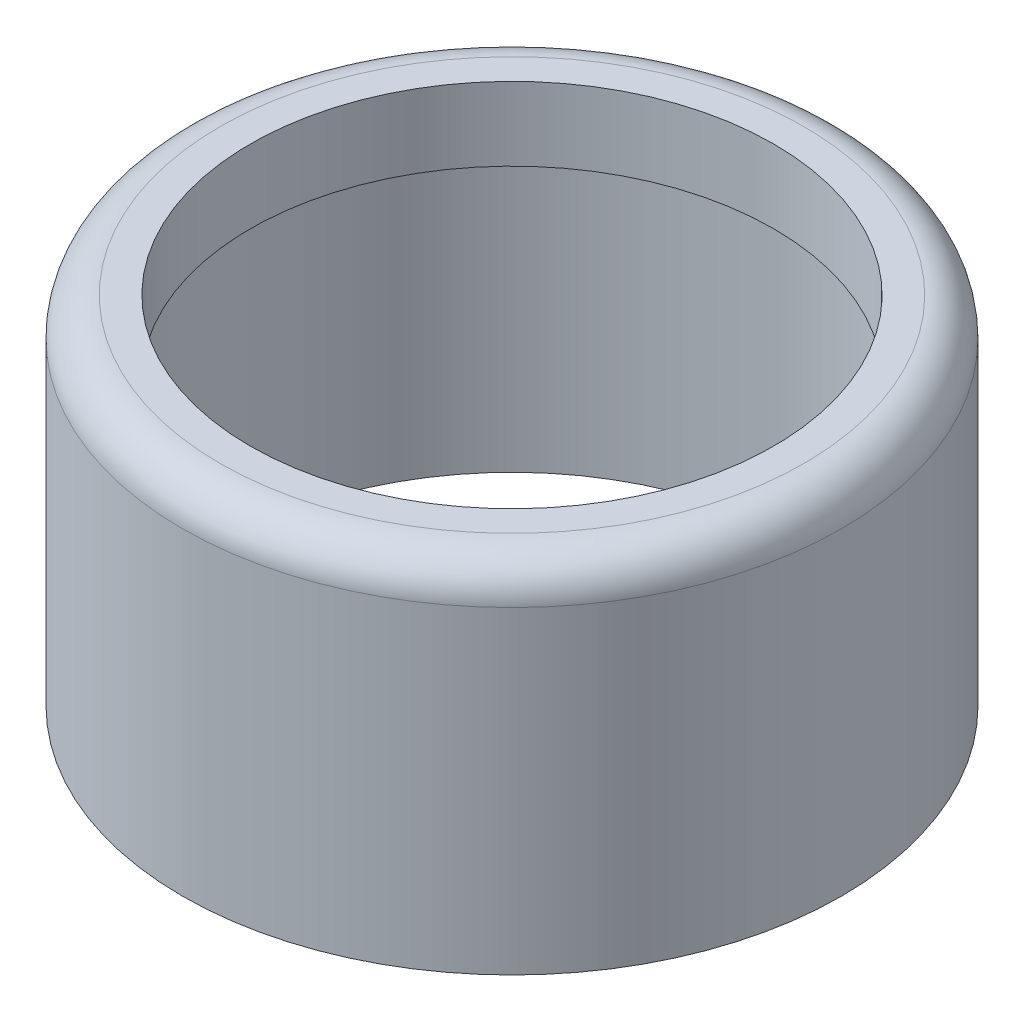
ISO-10303-21;
HEADER;
FILE_DESCRIPTION(('STEP AP214'),'2;1');
FILE_NAME('part.step','',(''),(''),'','','');
FILE_SCHEMA(('AUTOMOTIVE_DESIGN { 1 0 10303 214 1 1 1 1 }'));
ENDSEC;
DATA;
#1=APPLICATION_CONTEXT('core data for automotive mechanical design processes');
#2=APPLICATION_PROTOCOL_DEFINITION('international standard','automotive_design',2000,#1);
#3=PRODUCT_CONTEXT('',#1,'mechanical');
#4=PRODUCT('Part','Part','',(#3));
#5=PRODUCT_RELATED_PRODUCT_CATEGORY('part','',(#4));
#6=PRODUCT_DEFINITION_FORMATION('','',#4);
#7=PRODUCT_DEFINITION_CONTEXT('part definition',#1,'design');
#8=PRODUCT_DEFINITION('design','',#6,#7);
#9=PRODUCT_DEFINITION_SHAPE('','',#8);
#10=(LENGTH_UNIT() NAMED_UNIT(*) SI_UNIT(.MILLI.,.METRE.));
#11=(NAMED_UNIT(*) PLANE_ANGLE_UNIT() SI_UNIT($,.RADIAN.));
#12=(NAMED_UNIT(*) SI_UNIT($,.STERADIAN.) SOLID_ANGLE_UNIT());
#13=UNCERTAINTY_MEASURE_WITH_UNIT(LENGTH_MEASURE(1.E-05),#10,'distance_accuracy_value','');
#14=(GEOMETRIC_REPRESENTATION_CONTEXT(3) GLOBAL_UNCERTAINTY_ASSIGNED_CONTEXT((#13)) GLOBAL_UNIT_ASSIGNED_CONTEXT((#10,
#11,#12)) REPRESENTATION_CONTEXT('',''));
#15=CARTESIAN_POINT('',(0.,0.,0.));
#16=DIRECTION('',(0.,0.,1.));
#17=DIRECTION('',(1.,0.,0.));
#18=AXIS2_PLACEMENT_3D('',#15,#16,#17);
#19=CARTESIAN_POINT('',(0.,-2.9624390955405,0.));
#20=DIRECTION('',(0.,1.,0.));
#21=DIRECTION('',(0.,0.,1.));
#22=AXIS2_PLACEMENT_3D('',#19,#20,#21);
#23=TOROIDAL_SURFACE('',#22,15.5,2.);
#24=CARTESIAN_POINT('',(0.,-0.962439095540502,0.));
#25=DIRECTION('',(0.,1.,0.));
#26=DIRECTION('',(0.,0.,1.));
#27=AXIS2_PLACEMENT_3D('',#24,#25,#26);
#28=CIRCLE('',#27,15.5);
#29=CARTESIAN_POINT('',(0.,-0.962439095540502,15.5));
#30=VERTEX_POINT('',#29);
#31=EDGE_CURVE('E10',#30,#30,#28,.T.);
#32=ORIENTED_EDGE('',*,*,#31,.F.);
#33=EDGE_LOOP('',(#32));
#34=FACE_BOUND('',#33,.T.);
#35=CARTESIAN_POINT('',(0.,-2.9624390955405,0.));
#36=DIRECTION('',(0.,1.,0.));
#37=DIRECTION('',(0.,0.,1.));
#38=AXIS2_PLACEMENT_3D('',#35,#36,#37);
#39=CIRCLE('',#38,17.5);
#40=CARTESIAN_POINT('',(0.,-2.9624390955405,17.5));
#41=VERTEX_POINT('',#40);
#42=EDGE_CURVE('E72',#41,#41,#39,.T.);
#43=ORIENTED_EDGE('',*,*,#42,.T.);
#44=EDGE_LOOP('',(#43));
#45=FACE_BOUND('',#44,.T.);
#46=ADVANCED_FACE('F41',(#34,#45),#23,.T.);
#47=CARTESIAN_POINT('',(13.9,-0.962439095540502,0.));
#48=DIRECTION('',(0.,-1.,0.));
#49=DIRECTION('',(0.,0.,-1.));
#50=AXIS2_PLACEMENT_3D('',#47,#48,#49);
#51=PLANE('',#50);
#52=CARTESIAN_POINT('',(0.,-0.962439095540502,0.));
#53=DIRECTION('',(0.,1.,0.));
#54=DIRECTION('',(0.,0.,1.));
#55=AXIS2_PLACEMENT_3D('',#52,#53,#54);
#56=CIRCLE('',#55,13.9);
#57=CARTESIAN_POINT('',(0.,-0.962439095540502,13.9));
#58=VERTEX_POINT('',#57);
#59=EDGE_CURVE('E48',#58,#58,#56,.T.);
#60=ORIENTED_EDGE('',*,*,#59,.F.);
#61=EDGE_LOOP('',(#60));
#62=FACE_BOUND('',#61,.T.);
#63=ORIENTED_EDGE('',*,*,#31,.T.);
#64=EDGE_LOOP('',(#63));
#65=FACE_BOUND('',#64,.T.);
#66=ADVANCED_FACE('F104',(#62,#65),#51,.F.);
#67=CARTESIAN_POINT('',(0.,0.,0.));
#68=DIRECTION('',(0.,1.,0.));
#69=DIRECTION('',(0.,0.,1.));
#70=AXIS2_PLACEMENT_3D('',#67,#68,#69);
#71=CYLINDRICAL_SURFACE('',#70,13.9);
#72=CARTESIAN_POINT('',(0.,-4.8624390955405,0.));
#73=DIRECTION('',(0.,1.,0.));
#74=DIRECTION('',(0.,0.,1.));
#75=AXIS2_PLACEMENT_3D('',#72,#73,#74);
#76=CIRCLE('',#75,13.9);
#77=CARTESIAN_POINT('',(0.,-4.8624390955405,13.9));
#78=VERTEX_POINT('',#77);
#79=EDGE_CURVE('E53',#78,#78,#76,.T.);
#80=ORIENTED_EDGE('',*,*,#79,.F.);
#81=EDGE_LOOP('',(#80));
#82=FACE_BOUND('',#81,.T.);
#83=ORIENTED_EDGE('',*,*,#59,.T.);
#84=EDGE_LOOP('',(#83));
#85=FACE_BOUND('',#84,.T.);
#86=ADVANCED_FACE('F99',(#82,#85),#71,.F.);
#87=CARTESIAN_POINT('',(15.2,-4.8624390955405,0.));
#88=DIRECTION('',(0.,1.,0.));
#89=DIRECTION('',(0.,0.,1.));
#90=AXIS2_PLACEMENT_3D('',#87,#88,#89);
#91=PLANE('',#90);
#92=CARTESIAN_POINT('',(0.,-4.8624390955405,0.));
#93=DIRECTION('',(0.,1.,0.));
#94=DIRECTION('',(0.,0.,1.));
#95=AXIS2_PLACEMENT_3D('',#92,#93,#94);
#96=CIRCLE('',#95,15.2);
#97=CARTESIAN_POINT('',(0.,-4.8624390955405,15.2));
#98=VERTEX_POINT('',#97);
#99=EDGE_CURVE('E58',#98,#98,#96,.T.);
#100=ORIENTED_EDGE('',*,*,#99,.F.);
#101=EDGE_LOOP('',(#100));
#102=FACE_BOUND('',#101,.T.);
#103=ORIENTED_EDGE('',*,*,#79,.T.);
#104=EDGE_LOOP('',(#103));
#105=FACE_BOUND('',#104,.T.);
#106=ADVANCED_FACE('F93',(#102,#105),#91,.F.);
#107=CARTESIAN_POINT('',(0.,0.,0.));
#108=DIRECTION('',(0.,1.,0.));
#109=DIRECTION('',(0.,0.,1.));
#110=AXIS2_PLACEMENT_3D('',#107,#108,#109);
#111=CYLINDRICAL_SURFACE('',#110,15.2);
#112=CARTESIAN_POINT('',(0.,-19.8624390955405,0.));
#113=DIRECTION('',(0.,1.,0.));
#114=DIRECTION('',(0.,0.,1.));
#115=AXIS2_PLACEMENT_3D('',#112,#113,#114);
#116=CIRCLE('',#115,15.2);
#117=CARTESIAN_POINT('',(0.,-19.8624390955405,15.2));
#118=VERTEX_POINT('',#117);
#119=EDGE_CURVE('E64',#118,#118,#116,.T.);
#120=ORIENTED_EDGE('',*,*,#119,.F.);
#121=EDGE_LOOP('',(#120));
#122=FACE_BOUND('',#121,.T.);
#123=ORIENTED_EDGE('',*,*,#99,.T.);
#124=EDGE_LOOP('',(#123));
#125=FACE_BOUND('',#124,.T.);
#126=ADVANCED_FACE('F87',(#122,#125),#111,.F.);
#127=CARTESIAN_POINT('',(17.5,-19.8624390955405,0.));
#128=DIRECTION('',(0.,1.,0.));
#129=DIRECTION('',(0.,0.,1.));
#130=AXIS2_PLACEMENT_3D('',#127,#128,#129);
#131=PLANE('',#130);
#132=CARTESIAN_POINT('',(0.,-19.8624390955405,0.));
#133=DIRECTION('',(0.,1.,0.));
#134=DIRECTION('',(0.,0.,1.));
#135=AXIS2_PLACEMENT_3D('',#132,#133,#134);
#136=CIRCLE('',#135,17.5);
#137=CARTESIAN_POINT('',(0.,-19.8624390955405,17.5));
#138=VERTEX_POINT('',#137);
#139=EDGE_CURVE('E68',#138,#138,#136,.T.);
#140=ORIENTED_EDGE('',*,*,#139,.F.);
#141=EDGE_LOOP('',(#140));
#142=FACE_BOUND('',#141,.T.);
#143=ORIENTED_EDGE('',*,*,#119,.T.);
#144=EDGE_LOOP('',(#143));
#145=FACE_BOUND('',#144,.T.);
#146=ADVANCED_FACE('F81',(#142,#145),#131,.F.);
#147=CARTESIAN_POINT('',(0.,0.,0.));
#148=DIRECTION('',(0.,1.,0.));
#149=DIRECTION('',(0.,0.,1.));
#150=AXIS2_PLACEMENT_3D('',#147,#148,#149);
#151=CYLINDRICAL_SURFACE('',#150,17.5);
#152=ORIENTED_EDGE('',*,*,#42,.F.);
#153=EDGE_LOOP('',(#152));
#154=FACE_BOUND('',#153,.T.);
#155=ORIENTED_EDGE('',*,*,#139,.T.);
#156=EDGE_LOOP('',(#155));
#157=FACE_BOUND('',#156,.T.);
#158=ADVANCED_FACE('F78',(#154,#157),#151,.T.);
#159=CLOSED_SHELL('',(#46,#66,#86,#106,#126,#146,#158));
#160=MANIFOLD_SOLID_BREP('B2',#159);
#161=ADVANCED_BREP_SHAPE_REPRESENTATION('',(#18,#160),#14);
#162=SHAPE_DEFINITION_REPRESENTATION(#9,#161);
ENDSEC;
END-ISO-10303-21;
